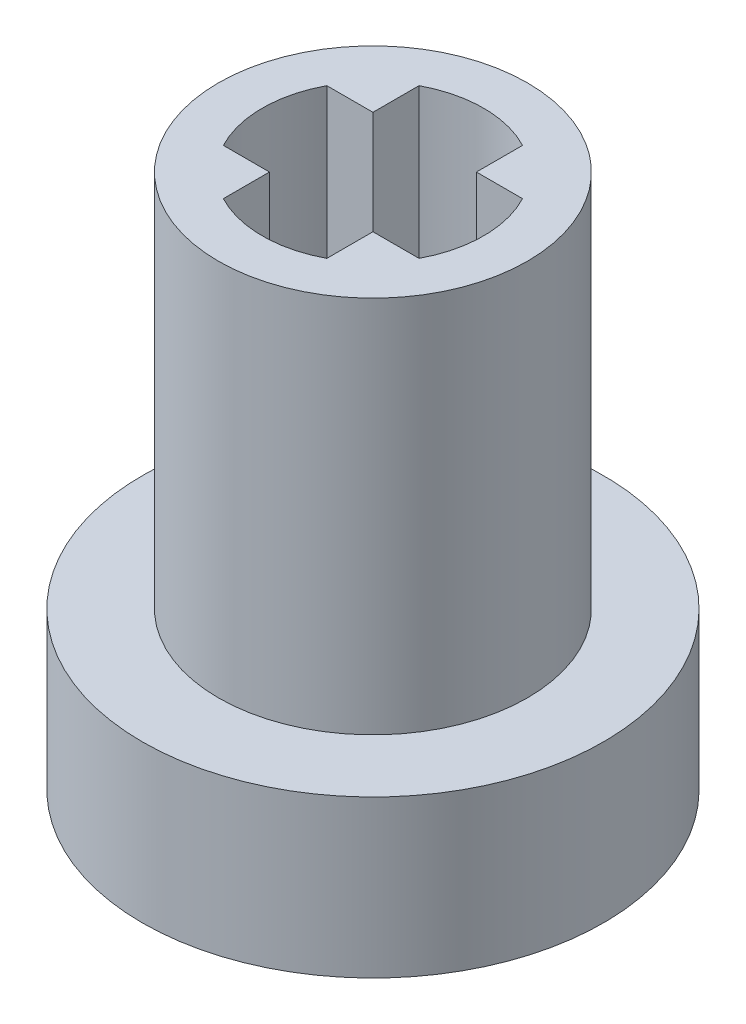
ISO-10303-21;
HEADER;
FILE_DESCRIPTION(('STEP AP214'),'2;1');
FILE_NAME('part.step','',(''),(''),'','','');
FILE_SCHEMA(('AUTOMOTIVE_DESIGN { 1 0 10303 214 1 1 1 1 }'));
ENDSEC;
DATA;
#1=APPLICATION_CONTEXT('core data for automotive mechanical design processes');
#2=APPLICATION_PROTOCOL_DEFINITION('international standard','automotive_design',2000,#1);
#3=PRODUCT_CONTEXT('',#1,'mechanical');
#4=PRODUCT('Part','Part','',(#3));
#5=PRODUCT_RELATED_PRODUCT_CATEGORY('part','',(#4));
#6=PRODUCT_DEFINITION_FORMATION('','',#4);
#7=PRODUCT_DEFINITION_CONTEXT('part definition',#1,'design');
#8=PRODUCT_DEFINITION('design','',#6,#7);
#9=PRODUCT_DEFINITION_SHAPE('','',#8);
#10=(LENGTH_UNIT() NAMED_UNIT(*) SI_UNIT(.MILLI.,.METRE.));
#11=(NAMED_UNIT(*) PLANE_ANGLE_UNIT() SI_UNIT($,.RADIAN.));
#12=(NAMED_UNIT(*) SI_UNIT($,.STERADIAN.) SOLID_ANGLE_UNIT());
#13=UNCERTAINTY_MEASURE_WITH_UNIT(LENGTH_MEASURE(1.E-05),#10,'distance_accuracy_value','');
#14=(GEOMETRIC_REPRESENTATION_CONTEXT(3) GLOBAL_UNCERTAINTY_ASSIGNED_CONTEXT((#13)) GLOBAL_UNIT_ASSIGNED_CONTEXT((#10,
#11,#12)) REPRESENTATION_CONTEXT('',''));
#15=CARTESIAN_POINT('',(0.,0.,0.));
#16=DIRECTION('',(0.,0.,1.));
#17=DIRECTION('',(1.,0.,0.));
#18=AXIS2_PLACEMENT_3D('',#15,#16,#17);
#19=CARTESIAN_POINT('',(0.,3.4,0.));
#20=DIRECTION('',(0.,-1.,0.));
#21=DIRECTION('',(0.,0.,-1.));
#22=AXIS2_PLACEMENT_3D('',#19,#20,#21);
#23=CYLINDRICAL_SURFACE('',#22,5.);
#24=CARTESIAN_POINT('',(0.,3.4,0.));
#25=DIRECTION('',(0.,1.,0.));
#26=DIRECTION('',(0.,0.,1.));
#27=AXIS2_PLACEMENT_3D('',#24,#25,#26);
#28=CIRCLE('',#27,5.);
#29=CARTESIAN_POINT('',(0.,3.4,5.));
#30=VERTEX_POINT('',#29);
#31=EDGE_CURVE('E82',#30,#30,#28,.T.);
#32=ORIENTED_EDGE('',*,*,#31,.F.);
#33=EDGE_LOOP('',(#32));
#34=FACE_BOUND('',#33,.T.);
#35=CARTESIAN_POINT('',(0.,0.,0.));
#36=DIRECTION('',(0.,1.,0.));
#37=DIRECTION('',(0.,0.,1.));
#38=AXIS2_PLACEMENT_3D('',#35,#36,#37);
#39=CIRCLE('',#38,5.);
#40=CARTESIAN_POINT('',(0.,0.,5.));
#41=VERTEX_POINT('',#40);
#42=EDGE_CURVE('E77',#41,#41,#39,.T.);
#43=ORIENTED_EDGE('',*,*,#42,.T.);
#44=EDGE_LOOP('',(#43));
#45=FACE_BOUND('',#44,.T.);
#46=ADVANCED_FACE('F74',(#34,#45),#23,.T.);
#47=CARTESIAN_POINT('',(0.,3.4,0.));
#48=DIRECTION('',(0.,1.,0.));
#49=DIRECTION('',(0.,0.,1.));
#50=AXIS2_PLACEMENT_3D('',#47,#48,#49);
#51=PLANE('',#50);
#52=CARTESIAN_POINT('',(0.,3.4,0.));
#53=DIRECTION('',(0.,1.,0.));
#54=DIRECTION('',(0.,0.,1.));
#55=AXIS2_PLACEMENT_3D('',#52,#53,#54);
#56=CIRCLE('',#55,3.35);
#57=CARTESIAN_POINT('',(0.,3.4,3.35));
#58=VERTEX_POINT('',#57);
#59=EDGE_CURVE('E12',#58,#58,#56,.T.);
#60=ORIENTED_EDGE('',*,*,#59,.F.);
#61=EDGE_LOOP('',(#60));
#62=FACE_BOUND('',#61,.T.);
#63=ORIENTED_EDGE('',*,*,#31,.T.);
#64=EDGE_LOOP('',(#63));
#65=FACE_BOUND('',#64,.T.);
#66=ADVANCED_FACE('F281',(#62,#65),#51,.T.);
#67=CARTESIAN_POINT('',(0.,0.,0.));
#68=DIRECTION('',(0.,1.,0.));
#69=DIRECTION('',(0.,0.,1.));
#70=AXIS2_PLACEMENT_3D('',#67,#68,#69);
#71=PLANE('',#70);
#72=CARTESIAN_POINT('',(0.,0.,0.));
#73=DIRECTION('',(0.,1.,0.));
#74=DIRECTION('',(0.,0.,1.));
#75=AXIS2_PLACEMENT_3D('',#72,#73,#74);
#76=CIRCLE('',#75,2.55);
#77=CARTESIAN_POINT('',(0.,0.,2.55));
#78=VERTEX_POINT('',#77);
#79=EDGE_CURVE('E265',#78,#78,#76,.T.);
#80=ORIENTED_EDGE('',*,*,#79,.T.);
#81=EDGE_LOOP('',(#80));
#82=FACE_BOUND('',#81,.T.);
#83=ORIENTED_EDGE('',*,*,#42,.F.);
#84=EDGE_LOOP('',(#83));
#85=FACE_BOUND('',#84,.T.);
#86=ADVANCED_FACE('F278',(#82,#85),#71,.F.);
#87=CARTESIAN_POINT('',(0.,2.4,0.));
#88=DIRECTION('',(0.,-1.,0.));
#89=DIRECTION('',(0.,0.,-1.));
#90=AXIS2_PLACEMENT_3D('',#87,#88,#89);
#91=CYLINDRICAL_SURFACE('',#90,2.55);
#92=CARTESIAN_POINT('',(0.,2.4,0.));
#93=DIRECTION('',(0.,1.,0.));
#94=DIRECTION('',(0.,0.,1.));
#95=AXIS2_PLACEMENT_3D('',#92,#93,#94);
#96=CIRCLE('',#95,2.55);
#97=CARTESIAN_POINT('',(0.,2.4,2.55));
#98=VERTEX_POINT('',#97);
#99=EDGE_CURVE('E267',#98,#98,#96,.T.);
#100=ORIENTED_EDGE('',*,*,#99,.T.);
#101=EDGE_LOOP('',(#100));
#102=FACE_BOUND('',#101,.T.);
#103=ORIENTED_EDGE('',*,*,#79,.F.);
#104=EDGE_LOOP('',(#103));
#105=FACE_BOUND('',#104,.T.);
#106=ADVANCED_FACE('F280',(#102,#105),#91,.F.);
#107=CARTESIAN_POINT('',(0.,2.4,0.));
#108=DIRECTION('',(0.,1.,0.));
#109=DIRECTION('',(0.,0.,1.));
#110=AXIS2_PLACEMENT_3D('',#107,#108,#109);
#111=PLANE('',#110);
#112=ORIENTED_EDGE('',*,*,#99,.F.);
#113=EDGE_LOOP('',(#112));
#114=FACE_BOUND('',#113,.T.);
#115=ADVANCED_FACE('F287',(#114),#111,.F.);
#116=CARTESIAN_POINT('',(0.,3.6,0.));
#117=DIRECTION('',(0.,-1.,0.));
#118=DIRECTION('',(0.,0.,-1.));
#119=AXIS2_PLACEMENT_3D('',#116,#117,#118);
#120=CYLINDRICAL_SURFACE('',#119,3.35);
#121=ORIENTED_EDGE('',*,*,#59,.T.);
#122=EDGE_LOOP('',(#121));
#123=FACE_BOUND('',#122,.T.);
#124=CARTESIAN_POINT('',(0.,11.6,0.));
#125=DIRECTION('',(0.,1.,0.));
#126=DIRECTION('',(0.,0.,1.));
#127=AXIS2_PLACEMENT_3D('',#124,#125,#126);
#128=CIRCLE('',#127,3.35);
#129=CARTESIAN_POINT('',(0.,11.6,3.35));
#130=VERTEX_POINT('',#129);
#131=EDGE_CURVE('E236',#130,#130,#128,.T.);
#132=ORIENTED_EDGE('',*,*,#131,.F.);
#133=EDGE_LOOP('',(#132));
#134=FACE_BOUND('',#133,.T.);
#135=ADVANCED_FACE('F311',(#123,#134),#120,.T.);
#136=CARTESIAN_POINT('',(0.,11.6,0.));
#137=DIRECTION('',(0.,1.,0.));
#138=DIRECTION('',(0.,0.,1.));
#139=AXIS2_PLACEMENT_3D('',#136,#137,#138);
#140=PLANE('',#139);
#141=DIRECTION('',(-1.,0.,0.));
#142=VECTOR('',#141,1.);
#143=CARTESIAN_POINT('',(0.,11.6,1.12172747402269));
#144=LINE('',#143,#142);
#145=CARTESIAN_POINT('',(2.12172747402269,11.6,1.12172747402269));
#146=VERTEX_POINT('',#145);
#147=CARTESIAN_POINT('',(1.12172747402269,11.6,1.12172747402269));
#148=VERTEX_POINT('',#147);
#149=EDGE_CURVE('E175',#146,#148,#144,.T.);
#150=ORIENTED_EDGE('',*,*,#149,.T.);
#151=DIRECTION('',(0.,0.,-1.));
#152=VECTOR('',#151,1.);
#153=CARTESIAN_POINT('',(1.12172747402269,11.6,0.));
#154=LINE('',#153,#152);
#155=CARTESIAN_POINT('',(1.12172747402269,11.6,2.12172747402268));
#156=VERTEX_POINT('',#155);
#157=EDGE_CURVE('E163',#156,#148,#154,.T.);
#158=ORIENTED_EDGE('',*,*,#157,.F.);
#159=CARTESIAN_POINT('',(0.,11.6,0.));
#160=DIRECTION('',(0.,1.,0.));
#161=DIRECTION('',(0.,0.,1.));
#162=AXIS2_PLACEMENT_3D('',#159,#160,#161);
#163=CIRCLE('',#162,2.4);
#164=CARTESIAN_POINT('',(-1.12172747402269,11.6,2.12172747402268));
#165=VERTEX_POINT('',#164);
#166=EDGE_CURVE('E174',#165,#156,#163,.T.);
#167=ORIENTED_EDGE('',*,*,#166,.F.);
#168=DIRECTION('',(0.,0.,-1.));
#169=VECTOR('',#168,1.);
#170=CARTESIAN_POINT('',(-1.12172747402269,11.6,0.));
#171=LINE('',#170,#169);
#172=CARTESIAN_POINT('',(-1.12172747402269,11.6,1.12172747402269));
#173=VERTEX_POINT('',#172);
#174=EDGE_CURVE('E191',#165,#173,#171,.T.);
#175=ORIENTED_EDGE('',*,*,#174,.T.);
#176=DIRECTION('',(-1.,0.,0.));
#177=VECTOR('',#176,1.);
#178=CARTESIAN_POINT('',(0.,11.6,1.12172747402269));
#179=LINE('',#178,#177);
#180=CARTESIAN_POINT('',(-2.12172747402268,11.6,1.12172747402269));
#181=VERTEX_POINT('',#180);
#182=EDGE_CURVE('E194',#173,#181,#179,.T.);
#183=ORIENTED_EDGE('',*,*,#182,.T.);
#184=CARTESIAN_POINT('',(0.,11.6,0.));
#185=DIRECTION('',(0.,1.,0.));
#186=DIRECTION('',(0.,0.,1.));
#187=AXIS2_PLACEMENT_3D('',#184,#185,#186);
#188=CIRCLE('',#187,2.4);
#189=CARTESIAN_POINT('',(-2.12172747402268,11.6,-1.12172747402269));
#190=VERTEX_POINT('',#189);
#191=EDGE_CURVE('E197',#190,#181,#188,.T.);
#192=ORIENTED_EDGE('',*,*,#191,.F.);
#193=DIRECTION('',(-1.,0.,0.));
#194=VECTOR('',#193,1.);
#195=CARTESIAN_POINT('',(0.,11.6,-1.12172747402269));
#196=LINE('',#195,#194);
#197=CARTESIAN_POINT('',(-1.12172747402269,11.6,-1.12172747402269));
#198=VERTEX_POINT('',#197);
#199=EDGE_CURVE('E199',#198,#190,#196,.T.);
#200=ORIENTED_EDGE('',*,*,#199,.F.);
#201=DIRECTION('',(0.,0.,-1.));
#202=VECTOR('',#201,1.);
#203=CARTESIAN_POINT('',(-1.12172747402269,11.6,0.));
#204=LINE('',#203,#202);
#205=CARTESIAN_POINT('',(-1.12172747402269,11.6,-2.12172747402269));
#206=VERTEX_POINT('',#205);
#207=EDGE_CURVE('E201',#198,#206,#204,.T.);
#208=ORIENTED_EDGE('',*,*,#207,.T.);
#209=CARTESIAN_POINT('',(0.,11.6,0.));
#210=DIRECTION('',(0.,1.,0.));
#211=DIRECTION('',(0.,0.,1.));
#212=AXIS2_PLACEMENT_3D('',#209,#210,#211);
#213=CIRCLE('',#212,2.4);
#214=CARTESIAN_POINT('',(1.12172747402269,11.6,-2.12172747402269));
#215=VERTEX_POINT('',#214);
#216=EDGE_CURVE('E204',#215,#206,#213,.T.);
#217=ORIENTED_EDGE('',*,*,#216,.F.);
#218=DIRECTION('',(0.,0.,-1.));
#219=VECTOR('',#218,1.);
#220=CARTESIAN_POINT('',(1.12172747402269,11.6,0.));
#221=LINE('',#220,#219);
#222=CARTESIAN_POINT('',(1.12172747402269,11.6,-1.12172747402269));
#223=VERTEX_POINT('',#222);
#224=EDGE_CURVE('E206',#223,#215,#221,.T.);
#225=ORIENTED_EDGE('',*,*,#224,.F.);
#226=DIRECTION('',(-1.,0.,0.));
#227=VECTOR('',#226,1.);
#228=CARTESIAN_POINT('',(0.,11.6,-1.12172747402269));
#229=LINE('',#228,#227);
#230=CARTESIAN_POINT('',(2.12172747402269,11.6,-1.12172747402269));
#231=VERTEX_POINT('',#230);
#232=EDGE_CURVE('E208',#231,#223,#229,.T.);
#233=ORIENTED_EDGE('',*,*,#232,.F.);
#234=CARTESIAN_POINT('',(0.,11.6,0.));
#235=DIRECTION('',(0.,1.,0.));
#236=DIRECTION('',(0.,0.,1.));
#237=AXIS2_PLACEMENT_3D('',#234,#235,#236);
#238=CIRCLE('',#237,2.4);
#239=EDGE_CURVE('E181',#146,#231,#238,.T.);
#240=ORIENTED_EDGE('',*,*,#239,.F.);
#241=EDGE_LOOP('',(#150,#158,#167,#175,#183,#192,#200,#208,#217,#225,#233,#240));
#242=FACE_BOUND('',#241,.T.);
#243=ORIENTED_EDGE('',*,*,#131,.T.);
#244=EDGE_LOOP('',(#243));
#245=FACE_BOUND('',#244,.T.);
#246=ADVANCED_FACE('F183',(#242,#245),#140,.T.);
#247=CARTESIAN_POINT('',(0.,11.6,1.12172747402269));
#248=DIRECTION('',(0.,0.,1.));
#249=DIRECTION('',(1.,0.,0.));
#250=AXIS2_PLACEMENT_3D('',#247,#248,#249);
#251=PLANE('',#250);
#252=DIRECTION('',(-1.,0.,0.));
#253=VECTOR('',#252,1.);
#254=CARTESIAN_POINT('',(0.,3.6,1.12172747402269));
#255=LINE('',#254,#253);
#256=CARTESIAN_POINT('',(2.12172747402269,3.6,1.12172747402269));
#257=VERTEX_POINT('',#256);
#258=CARTESIAN_POINT('',(1.12172747402269,3.6,1.12172747402269));
#259=VERTEX_POINT('',#258);
#260=EDGE_CURVE('E90',#257,#259,#255,.T.);
#261=ORIENTED_EDGE('',*,*,#260,.T.);
#262=DIRECTION('',(0.,-1.,0.));
#263=VECTOR('',#262,1.);
#264=CARTESIAN_POINT('',(1.12172747402269,11.6,1.12172747402269));
#265=LINE('',#264,#263);
#266=EDGE_CURVE('E167',#148,#259,#265,.T.);
#267=ORIENTED_EDGE('',*,*,#266,.F.);
#268=ORIENTED_EDGE('',*,*,#149,.F.);
#269=DIRECTION('',(0.,-1.,0.));
#270=VECTOR('',#269,1.);
#271=CARTESIAN_POINT('',(2.12172747402269,11.6,1.12172747402269));
#272=LINE('',#271,#270);
#273=EDGE_CURVE('E234',#146,#257,#272,.T.);
#274=ORIENTED_EDGE('',*,*,#273,.T.);
#275=EDGE_LOOP('',(#261,#267,#268,#274));
#276=FACE_BOUND('',#275,.T.);
#277=ADVANCED_FACE('F179',(#276),#251,.F.);
#278=CARTESIAN_POINT('',(0.,11.6,0.));
#279=DIRECTION('',(0.,-1.,0.));
#280=DIRECTION('',(0.,0.,-1.));
#281=AXIS2_PLACEMENT_3D('',#278,#279,#280);
#282=CYLINDRICAL_SURFACE('',#281,2.4);
#283=CARTESIAN_POINT('',(0.,3.6,0.));
#284=DIRECTION('',(0.,1.,0.));
#285=DIRECTION('',(0.,0.,1.));
#286=AXIS2_PLACEMENT_3D('',#283,#284,#285);
#287=CIRCLE('',#286,2.4);
#288=CARTESIAN_POINT('',(2.12172747402269,3.6,-1.12172747402269));
#289=VERTEX_POINT('',#288);
#290=EDGE_CURVE('E95',#257,#289,#287,.T.);
#291=ORIENTED_EDGE('',*,*,#290,.F.);
#292=ORIENTED_EDGE('',*,*,#273,.F.);
#293=ORIENTED_EDGE('',*,*,#239,.T.);
#294=DIRECTION('',(0.,-1.,0.));
#295=VECTOR('',#294,1.);
#296=CARTESIAN_POINT('',(2.12172747402269,11.6,-1.12172747402269));
#297=LINE('',#296,#295);
#298=EDGE_CURVE('E237',#231,#289,#297,.T.);
#299=ORIENTED_EDGE('',*,*,#298,.T.);
#300=EDGE_LOOP('',(#291,#292,#293,#299));
#301=FACE_BOUND('',#300,.T.);
#302=ADVANCED_FACE('F337',(#301),#282,.F.);
#303=CARTESIAN_POINT('',(0.,11.6,-1.12172747402269));
#304=DIRECTION('',(0.,0.,1.));
#305=DIRECTION('',(1.,0.,0.));
#306=AXIS2_PLACEMENT_3D('',#303,#304,#305);
#307=PLANE('',#306);
#308=DIRECTION('',(-1.,0.,0.));
#309=VECTOR('',#308,1.);
#310=CARTESIAN_POINT('',(0.,3.6,-1.12172747402269));
#311=LINE('',#310,#309);
#312=CARTESIAN_POINT('',(1.12172747402269,3.6,-1.12172747402269));
#313=VERTEX_POINT('',#312);
#314=EDGE_CURVE('E187',#289,#313,#311,.T.);
#315=ORIENTED_EDGE('',*,*,#314,.F.);
#316=ORIENTED_EDGE('',*,*,#298,.F.);
#317=ORIENTED_EDGE('',*,*,#232,.T.);
#318=DIRECTION('',(0.,-1.,0.));
#319=VECTOR('',#318,1.);
#320=CARTESIAN_POINT('',(1.12172747402269,11.6,-1.12172747402269));
#321=LINE('',#320,#319);
#322=EDGE_CURVE('E239',#223,#313,#321,.T.);
#323=ORIENTED_EDGE('',*,*,#322,.T.);
#324=EDGE_LOOP('',(#315,#316,#317,#323));
#325=FACE_BOUND('',#324,.T.);
#326=ADVANCED_FACE('F346',(#325),#307,.T.);
#327=CARTESIAN_POINT('',(1.12172747402269,11.6,0.));
#328=DIRECTION('',(-1.,0.,0.));
#329=DIRECTION('',(0.,0.,1.));
#330=AXIS2_PLACEMENT_3D('',#327,#328,#329);
#331=PLANE('',#330);
#332=DIRECTION('',(0.,0.,-1.));
#333=VECTOR('',#332,1.);
#334=CARTESIAN_POINT('',(1.12172747402269,3.6,0.));
#335=LINE('',#334,#333);
#336=CARTESIAN_POINT('',(1.12172747402269,3.6,-2.12172747402269));
#337=VERTEX_POINT('',#336);
#338=EDGE_CURVE('E231',#313,#337,#335,.T.);
#339=ORIENTED_EDGE('',*,*,#338,.F.);
#340=ORIENTED_EDGE('',*,*,#322,.F.);
#341=ORIENTED_EDGE('',*,*,#224,.T.);
#342=DIRECTION('',(0.,-1.,0.));
#343=VECTOR('',#342,1.);
#344=CARTESIAN_POINT('',(1.12172747402269,11.6,-2.12172747402269));
#345=LINE('',#344,#343);
#346=EDGE_CURVE('E242',#215,#337,#345,.T.);
#347=ORIENTED_EDGE('',*,*,#346,.T.);
#348=EDGE_LOOP('',(#339,#340,#341,#347));
#349=FACE_BOUND('',#348,.T.);
#350=ADVANCED_FACE('F356',(#349),#331,.T.);
#351=CARTESIAN_POINT('',(0.,11.6,0.));
#352=DIRECTION('',(0.,-1.,0.));
#353=DIRECTION('',(0.,0.,-1.));
#354=AXIS2_PLACEMENT_3D('',#351,#352,#353);
#355=CYLINDRICAL_SURFACE('',#354,2.4);
#356=CARTESIAN_POINT('',(0.,3.6,0.));
#357=DIRECTION('',(0.,1.,0.));
#358=DIRECTION('',(0.,0.,1.));
#359=AXIS2_PLACEMENT_3D('',#356,#357,#358);
#360=CIRCLE('',#359,2.4);
#361=CARTESIAN_POINT('',(-1.12172747402269,3.6,-2.12172747402269));
#362=VERTEX_POINT('',#361);
#363=EDGE_CURVE('E229',#337,#362,#360,.T.);
#364=ORIENTED_EDGE('',*,*,#363,.F.);
#365=ORIENTED_EDGE('',*,*,#346,.F.);
#366=ORIENTED_EDGE('',*,*,#216,.T.);
#367=DIRECTION('',(0.,-1.,0.));
#368=VECTOR('',#367,1.);
#369=CARTESIAN_POINT('',(-1.12172747402269,11.6,-2.12172747402269));
#370=LINE('',#369,#368);
#371=EDGE_CURVE('E245',#206,#362,#370,.T.);
#372=ORIENTED_EDGE('',*,*,#371,.T.);
#373=EDGE_LOOP('',(#364,#365,#366,#372));
#374=FACE_BOUND('',#373,.T.);
#375=ADVANCED_FACE('F366',(#374),#355,.F.);
#376=CARTESIAN_POINT('',(-1.12172747402269,11.6,0.));
#377=DIRECTION('',(-1.,0.,0.));
#378=DIRECTION('',(0.,0.,1.));
#379=AXIS2_PLACEMENT_3D('',#376,#377,#378);
#380=PLANE('',#379);
#381=DIRECTION('',(0.,0.,-1.));
#382=VECTOR('',#381,1.);
#383=CARTESIAN_POINT('',(-1.12172747402269,3.6,0.));
#384=LINE('',#383,#382);
#385=CARTESIAN_POINT('',(-1.12172747402269,3.6,-1.12172747402269));
#386=VERTEX_POINT('',#385);
#387=EDGE_CURVE('E226',#386,#362,#384,.T.);
#388=ORIENTED_EDGE('',*,*,#387,.T.);
#389=ORIENTED_EDGE('',*,*,#371,.F.);
#390=ORIENTED_EDGE('',*,*,#207,.F.);
#391=DIRECTION('',(0.,-1.,0.));
#392=VECTOR('',#391,1.);
#393=CARTESIAN_POINT('',(-1.12172747402269,11.6,-1.12172747402269));
#394=LINE('',#393,#392);
#395=EDGE_CURVE('E248',#198,#386,#394,.T.);
#396=ORIENTED_EDGE('',*,*,#395,.T.);
#397=EDGE_LOOP('',(#388,#389,#390,#396));
#398=FACE_BOUND('',#397,.T.);
#399=ADVANCED_FACE('F376',(#398),#380,.F.);
#400=CARTESIAN_POINT('',(0.,11.6,-1.12172747402269));
#401=DIRECTION('',(0.,0.,1.));
#402=DIRECTION('',(1.,0.,0.));
#403=AXIS2_PLACEMENT_3D('',#400,#401,#402);
#404=PLANE('',#403);
#405=DIRECTION('',(-1.,0.,0.));
#406=VECTOR('',#405,1.);
#407=CARTESIAN_POINT('',(0.,3.6,-1.12172747402269));
#408=LINE('',#407,#406);
#409=CARTESIAN_POINT('',(-2.12172747402268,3.6,-1.12172747402269));
#410=VERTEX_POINT('',#409);
#411=EDGE_CURVE('E224',#386,#410,#408,.T.);
#412=ORIENTED_EDGE('',*,*,#411,.F.);
#413=ORIENTED_EDGE('',*,*,#395,.F.);
#414=ORIENTED_EDGE('',*,*,#199,.T.);
#415=DIRECTION('',(0.,-1.,0.));
#416=VECTOR('',#415,1.);
#417=CARTESIAN_POINT('',(-2.12172747402268,11.6,-1.12172747402269));
#418=LINE('',#417,#416);
#419=EDGE_CURVE('E251',#190,#410,#418,.T.);
#420=ORIENTED_EDGE('',*,*,#419,.T.);
#421=EDGE_LOOP('',(#412,#413,#414,#420));
#422=FACE_BOUND('',#421,.T.);
#423=ADVANCED_FACE('F386',(#422),#404,.T.);
#424=CARTESIAN_POINT('',(0.,11.6,0.));
#425=DIRECTION('',(0.,-1.,0.));
#426=DIRECTION('',(0.,0.,-1.));
#427=AXIS2_PLACEMENT_3D('',#424,#425,#426);
#428=CYLINDRICAL_SURFACE('',#427,2.4);
#429=CARTESIAN_POINT('',(0.,3.6,0.));
#430=DIRECTION('',(0.,1.,0.));
#431=DIRECTION('',(0.,0.,1.));
#432=AXIS2_PLACEMENT_3D('',#429,#430,#431);
#433=CIRCLE('',#432,2.4);
#434=CARTESIAN_POINT('',(-2.12172747402268,3.6,1.12172747402269));
#435=VERTEX_POINT('',#434);
#436=EDGE_CURVE('E222',#410,#435,#433,.T.);
#437=ORIENTED_EDGE('',*,*,#436,.F.);
#438=ORIENTED_EDGE('',*,*,#419,.F.);
#439=ORIENTED_EDGE('',*,*,#191,.T.);
#440=DIRECTION('',(0.,-1.,0.));
#441=VECTOR('',#440,1.);
#442=CARTESIAN_POINT('',(-2.12172747402268,11.6,1.12172747402269));
#443=LINE('',#442,#441);
#444=EDGE_CURVE('E254',#181,#435,#443,.T.);
#445=ORIENTED_EDGE('',*,*,#444,.T.);
#446=EDGE_LOOP('',(#437,#438,#439,#445));
#447=FACE_BOUND('',#446,.T.);
#448=ADVANCED_FACE('F396',(#447),#428,.F.);
#449=CARTESIAN_POINT('',(0.,11.6,1.12172747402269));
#450=DIRECTION('',(0.,0.,1.));
#451=DIRECTION('',(1.,0.,0.));
#452=AXIS2_PLACEMENT_3D('',#449,#450,#451);
#453=PLANE('',#452);
#454=DIRECTION('',(-1.,0.,0.));
#455=VECTOR('',#454,1.);
#456=CARTESIAN_POINT('',(0.,3.6,1.12172747402269));
#457=LINE('',#456,#455);
#458=CARTESIAN_POINT('',(-1.12172747402269,3.6,1.12172747402269));
#459=VERTEX_POINT('',#458);
#460=EDGE_CURVE('E219',#459,#435,#457,.T.);
#461=ORIENTED_EDGE('',*,*,#460,.T.);
#462=ORIENTED_EDGE('',*,*,#444,.F.);
#463=ORIENTED_EDGE('',*,*,#182,.F.);
#464=DIRECTION('',(0.,-1.,0.));
#465=VECTOR('',#464,1.);
#466=CARTESIAN_POINT('',(-1.12172747402269,11.6,1.12172747402269));
#467=LINE('',#466,#465);
#468=EDGE_CURVE('E257',#173,#459,#467,.T.);
#469=ORIENTED_EDGE('',*,*,#468,.T.);
#470=EDGE_LOOP('',(#461,#462,#463,#469));
#471=FACE_BOUND('',#470,.T.);
#472=ADVANCED_FACE('F406',(#471),#453,.F.);
#473=CARTESIAN_POINT('',(-1.12172747402269,11.6,0.));
#474=DIRECTION('',(-1.,0.,0.));
#475=DIRECTION('',(0.,0.,1.));
#476=AXIS2_PLACEMENT_3D('',#473,#474,#475);
#477=PLANE('',#476);
#478=DIRECTION('',(0.,0.,-1.));
#479=VECTOR('',#478,1.);
#480=CARTESIAN_POINT('',(-1.12172747402269,3.6,0.));
#481=LINE('',#480,#479);
#482=CARTESIAN_POINT('',(-1.12172747402269,3.6,2.12172747402268));
#483=VERTEX_POINT('',#482);
#484=EDGE_CURVE('E216',#483,#459,#481,.T.);
#485=ORIENTED_EDGE('',*,*,#484,.T.);
#486=ORIENTED_EDGE('',*,*,#468,.F.);
#487=ORIENTED_EDGE('',*,*,#174,.F.);
#488=DIRECTION('',(0.,-1.,0.));
#489=VECTOR('',#488,1.);
#490=CARTESIAN_POINT('',(-1.12172747402269,11.6,2.12172747402268));
#491=LINE('',#490,#489);
#492=EDGE_CURVE('E260',#165,#483,#491,.T.);
#493=ORIENTED_EDGE('',*,*,#492,.T.);
#494=EDGE_LOOP('',(#485,#486,#487,#493));
#495=FACE_BOUND('',#494,.T.);
#496=ADVANCED_FACE('F416',(#495),#477,.F.);
#497=CARTESIAN_POINT('',(0.,11.6,0.));
#498=DIRECTION('',(0.,-1.,0.));
#499=DIRECTION('',(0.,0.,-1.));
#500=AXIS2_PLACEMENT_3D('',#497,#498,#499);
#501=CYLINDRICAL_SURFACE('',#500,2.4);
#502=CARTESIAN_POINT('',(0.,3.6,0.));
#503=DIRECTION('',(0.,1.,0.));
#504=DIRECTION('',(0.,0.,1.));
#505=AXIS2_PLACEMENT_3D('',#502,#503,#504);
#506=CIRCLE('',#505,2.4);
#507=CARTESIAN_POINT('',(1.12172747402269,3.6,2.12172747402268));
#508=VERTEX_POINT('',#507);
#509=EDGE_CURVE('E214',#483,#508,#506,.T.);
#510=ORIENTED_EDGE('',*,*,#509,.F.);
#511=ORIENTED_EDGE('',*,*,#492,.F.);
#512=ORIENTED_EDGE('',*,*,#166,.T.);
#513=DIRECTION('',(0.,-1.,0.));
#514=VECTOR('',#513,1.);
#515=CARTESIAN_POINT('',(1.12172747402269,11.6,2.12172747402268));
#516=LINE('',#515,#514);
#517=EDGE_CURVE('E169',#156,#508,#516,.T.);
#518=ORIENTED_EDGE('',*,*,#517,.T.);
#519=EDGE_LOOP('',(#510,#511,#512,#518));
#520=FACE_BOUND('',#519,.T.);
#521=ADVANCED_FACE('F426',(#520),#501,.F.);
#522=CARTESIAN_POINT('',(1.12172747402269,11.6,0.));
#523=DIRECTION('',(-1.,0.,0.));
#524=DIRECTION('',(0.,0.,1.));
#525=AXIS2_PLACEMENT_3D('',#522,#523,#524);
#526=PLANE('',#525);
#527=DIRECTION('',(0.,0.,-1.));
#528=VECTOR('',#527,1.);
#529=CARTESIAN_POINT('',(1.12172747402269,3.6,0.));
#530=LINE('',#529,#528);
#531=EDGE_CURVE('E212',#508,#259,#530,.T.);
#532=ORIENTED_EDGE('',*,*,#531,.F.);
#533=ORIENTED_EDGE('',*,*,#517,.F.);
#534=ORIENTED_EDGE('',*,*,#157,.T.);
#535=ORIENTED_EDGE('',*,*,#266,.T.);
#536=EDGE_LOOP('',(#532,#533,#534,#535));
#537=FACE_BOUND('',#536,.T.);
#538=ADVANCED_FACE('F166',(#537),#526,.T.);
#539=CARTESIAN_POINT('',(0.,3.6,0.));
#540=DIRECTION('',(0.,1.,0.));
#541=DIRECTION('',(0.,0.,1.));
#542=AXIS2_PLACEMENT_3D('',#539,#540,#541);
#543=PLANE('',#542);
#544=ORIENTED_EDGE('',*,*,#531,.T.);
#545=ORIENTED_EDGE('',*,*,#260,.F.);
#546=ORIENTED_EDGE('',*,*,#290,.T.);
#547=ORIENTED_EDGE('',*,*,#314,.T.);
#548=ORIENTED_EDGE('',*,*,#338,.T.);
#549=ORIENTED_EDGE('',*,*,#363,.T.);
#550=ORIENTED_EDGE('',*,*,#387,.F.);
#551=ORIENTED_EDGE('',*,*,#411,.T.);
#552=ORIENTED_EDGE('',*,*,#436,.T.);
#553=ORIENTED_EDGE('',*,*,#460,.F.);
#554=ORIENTED_EDGE('',*,*,#484,.F.);
#555=ORIENTED_EDGE('',*,*,#509,.T.);
#556=EDGE_LOOP('',(#544,#545,#546,#547,#548,#549,#550,#551,#552,#553,#554,#555));
#557=FACE_BOUND('',#556,.T.);
#558=ADVANCED_FACE('F445',(#557),#543,.T.);
#559=CLOSED_SHELL('',(#46,#66,#86,#106,#115,#135,#246,#277,#302,#326,#350,#375,#399,#423,#448,
#472,#496,#521,#538,#558));
#560=MANIFOLD_SOLID_BREP('B2',#559);
#561=ADVANCED_BREP_SHAPE_REPRESENTATION('',(#18,#560),#14);
#562=SHAPE_DEFINITION_REPRESENTATION(#9,#561);
ENDSEC;
END-ISO-10303-21;
